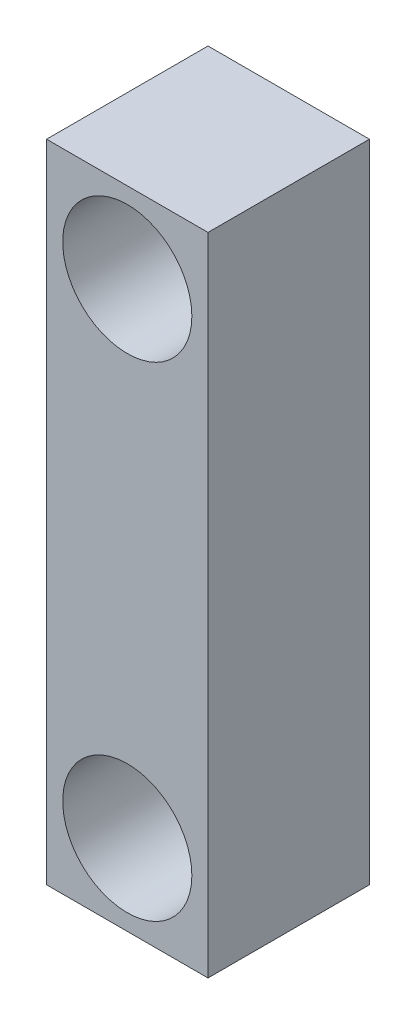
ISO-10303-21;
HEADER;
FILE_DESCRIPTION(('STEP AP214'),'2;1');
FILE_NAME('part.step','',(''),(''),'','','');
FILE_SCHEMA(('AUTOMOTIVE_DESIGN { 1 0 10303 214 1 1 1 1 }'));
ENDSEC;
DATA;
#1=APPLICATION_CONTEXT('core data for automotive mechanical design processes');
#2=APPLICATION_PROTOCOL_DEFINITION('international standard','automotive_design',2000,#1);
#3=PRODUCT_CONTEXT('',#1,'mechanical');
#4=PRODUCT('Part','Part','',(#3));
#5=PRODUCT_RELATED_PRODUCT_CATEGORY('part','',(#4));
#6=PRODUCT_DEFINITION_FORMATION('','',#4);
#7=PRODUCT_DEFINITION_CONTEXT('part definition',#1,'design');
#8=PRODUCT_DEFINITION('design','',#6,#7);
#9=PRODUCT_DEFINITION_SHAPE('','',#8);
#10=(LENGTH_UNIT() NAMED_UNIT(*) SI_UNIT(.MILLI.,.METRE.));
#11=(NAMED_UNIT(*) PLANE_ANGLE_UNIT() SI_UNIT($,.RADIAN.));
#12=(NAMED_UNIT(*) SI_UNIT($,.STERADIAN.) SOLID_ANGLE_UNIT());
#13=UNCERTAINTY_MEASURE_WITH_UNIT(LENGTH_MEASURE(1.E-05),#10,'distance_accuracy_value','');
#14=(GEOMETRIC_REPRESENTATION_CONTEXT(3) GLOBAL_UNCERTAINTY_ASSIGNED_CONTEXT((#13)) GLOBAL_UNIT_ASSIGNED_CONTEXT((#10,
#11,#12)) REPRESENTATION_CONTEXT('',''));
#15=CARTESIAN_POINT('',(0.,0.,0.));
#16=DIRECTION('',(0.,0.,1.));
#17=DIRECTION('',(1.,0.,0.));
#18=AXIS2_PLACEMENT_3D('',#15,#16,#17);
#19=CARTESIAN_POINT('',(38.1,152.4,50.8));
#20=DIRECTION('',(-1.,0.,0.));
#21=DIRECTION('',(0.,-1.,0.));
#22=AXIS2_PLACEMENT_3D('',#19,#20,#21);
#23=PLANE('',#22);
#24=DIRECTION('',(0.,1.,0.));
#25=VECTOR('',#24,1.);
#26=CARTESIAN_POINT('',(38.1,152.4,-25.4));
#27=LINE('',#26,#25);
#28=CARTESIAN_POINT('',(38.1,-152.4,-25.4));
#29=VERTEX_POINT('',#28);
#30=CARTESIAN_POINT('',(38.1,152.4,-25.4));
#31=VERTEX_POINT('',#30);
#32=EDGE_CURVE('E97',#29,#31,#27,.T.);
#33=ORIENTED_EDGE('',*,*,#32,.T.);
#34=DIRECTION('',(0.,0.,-1.));
#35=VECTOR('',#34,1.);
#36=CARTESIAN_POINT('',(38.1,152.4,50.8));
#37=LINE('',#36,#35);
#38=CARTESIAN_POINT('',(38.1,152.4,50.8));
#39=VERTEX_POINT('',#38);
#40=EDGE_CURVE('E11',#39,#31,#37,.T.);
#41=ORIENTED_EDGE('',*,*,#40,.F.);
#42=DIRECTION('',(0.,1.,0.));
#43=VECTOR('',#42,1.);
#44=CARTESIAN_POINT('',(38.1,152.4,50.8));
#45=LINE('',#44,#43);
#46=CARTESIAN_POINT('',(38.1,-152.4,50.8));
#47=VERTEX_POINT('',#46);
#48=EDGE_CURVE('E85',#47,#39,#45,.T.);
#49=ORIENTED_EDGE('',*,*,#48,.F.);
#50=DIRECTION('',(0.,0.,-1.));
#51=VECTOR('',#50,1.);
#52=CARTESIAN_POINT('',(38.1,-152.4,50.8));
#53=LINE('',#52,#51);
#54=EDGE_CURVE('E93',#47,#29,#53,.T.);
#55=ORIENTED_EDGE('',*,*,#54,.T.);
#56=EDGE_LOOP('',(#33,#41,#49,#55));
#57=FACE_BOUND('',#56,.T.);
#58=ADVANCED_FACE('F34',(#57),#23,.F.);
#59=CARTESIAN_POINT('',(-38.1,152.4,50.8));
#60=DIRECTION('',(0.,-1.,0.));
#61=DIRECTION('',(0.,0.,-1.));
#62=AXIS2_PLACEMENT_3D('',#59,#60,#61);
#63=PLANE('',#62);
#64=DIRECTION('',(-1.,0.,0.));
#65=VECTOR('',#64,1.);
#66=CARTESIAN_POINT('',(-38.1,152.4,-25.4));
#67=LINE('',#66,#65);
#68=CARTESIAN_POINT('',(-38.1,152.4,-25.4));
#69=VERTEX_POINT('',#68);
#70=EDGE_CURVE('E89',#31,#69,#67,.T.);
#71=ORIENTED_EDGE('',*,*,#70,.T.);
#72=DIRECTION('',(0.,0.,-1.));
#73=VECTOR('',#72,1.);
#74=CARTESIAN_POINT('',(-38.1,152.4,50.8));
#75=LINE('',#74,#73);
#76=CARTESIAN_POINT('',(-38.1,152.4,50.8));
#77=VERTEX_POINT('',#76);
#78=EDGE_CURVE('E42',#77,#69,#75,.T.);
#79=ORIENTED_EDGE('',*,*,#78,.F.);
#80=DIRECTION('',(-1.,0.,0.));
#81=VECTOR('',#80,1.);
#82=CARTESIAN_POINT('',(-38.1,152.4,50.8));
#83=LINE('',#82,#81);
#84=EDGE_CURVE('E80',#39,#77,#83,.T.);
#85=ORIENTED_EDGE('',*,*,#84,.F.);
#86=ORIENTED_EDGE('',*,*,#40,.T.);
#87=EDGE_LOOP('',(#71,#79,#85,#86));
#88=FACE_BOUND('',#87,.T.);
#89=ADVANCED_FACE('F88',(#88),#63,.F.);
#90=CARTESIAN_POINT('',(-38.1,152.4,50.8));
#91=DIRECTION('',(1.,0.,0.));
#92=DIRECTION('',(0.,1.,0.));
#93=AXIS2_PLACEMENT_3D('',#90,#91,#92);
#94=PLANE('',#93);
#95=DIRECTION('',(0.,-1.,0.));
#96=VECTOR('',#95,1.);
#97=CARTESIAN_POINT('',(-38.1,152.4,-25.4));
#98=LINE('',#97,#96);
#99=CARTESIAN_POINT('',(-38.1,-152.4,-25.4));
#100=VERTEX_POINT('',#99);
#101=EDGE_CURVE('E67',#69,#100,#98,.T.);
#102=ORIENTED_EDGE('',*,*,#101,.T.);
#103=DIRECTION('',(0.,0.,-1.));
#104=VECTOR('',#103,1.);
#105=CARTESIAN_POINT('',(-38.1,-152.4,50.8));
#106=LINE('',#105,#104);
#107=CARTESIAN_POINT('',(-38.1,-152.4,50.8));
#108=VERTEX_POINT('',#107);
#109=EDGE_CURVE('E90',#108,#100,#106,.T.);
#110=ORIENTED_EDGE('',*,*,#109,.F.);
#111=DIRECTION('',(0.,-1.,0.));
#112=VECTOR('',#111,1.);
#113=CARTESIAN_POINT('',(-38.1,152.4,50.8));
#114=LINE('',#113,#112);
#115=EDGE_CURVE('E83',#77,#108,#114,.T.);
#116=ORIENTED_EDGE('',*,*,#115,.F.);
#117=ORIENTED_EDGE('',*,*,#78,.T.);
#118=EDGE_LOOP('',(#102,#110,#116,#117));
#119=FACE_BOUND('',#118,.T.);
#120=ADVANCED_FACE('F91',(#119),#94,.F.);
#121=CARTESIAN_POINT('',(-38.1,-152.4,50.8));
#122=DIRECTION('',(0.,1.,0.));
#123=DIRECTION('',(0.,0.,1.));
#124=AXIS2_PLACEMENT_3D('',#121,#122,#123);
#125=PLANE('',#124);
#126=DIRECTION('',(1.,0.,0.));
#127=VECTOR('',#126,1.);
#128=CARTESIAN_POINT('',(-38.1,-152.4,-25.4));
#129=LINE('',#128,#127);
#130=EDGE_CURVE('E73',#100,#29,#129,.T.);
#131=ORIENTED_EDGE('',*,*,#130,.T.);
#132=ORIENTED_EDGE('',*,*,#54,.F.);
#133=DIRECTION('',(1.,0.,0.));
#134=VECTOR('',#133,1.);
#135=CARTESIAN_POINT('',(-38.1,-152.4,50.8));
#136=LINE('',#135,#134);
#137=EDGE_CURVE('E50',#108,#47,#136,.T.);
#138=ORIENTED_EDGE('',*,*,#137,.F.);
#139=ORIENTED_EDGE('',*,*,#109,.T.);
#140=EDGE_LOOP('',(#131,#132,#138,#139));
#141=FACE_BOUND('',#140,.T.);
#142=ADVANCED_FACE('F105',(#141),#125,.F.);
#143=CARTESIAN_POINT('',(0.,0.,50.8));
#144=DIRECTION('',(0.,0.,1.));
#145=DIRECTION('',(1.,0.,0.));
#146=AXIS2_PLACEMENT_3D('',#143,#144,#145);
#147=PLANE('',#146);
#148=CARTESIAN_POINT('',(0.,-114.3,50.8));
#149=DIRECTION('',(0.,0.,1.));
#150=DIRECTION('',(1.,0.,0.));
#151=AXIS2_PLACEMENT_3D('',#148,#149,#150);
#152=CIRCLE('',#151,30.48);
#153=CARTESIAN_POINT('',(30.48,-114.3,50.8));
#154=VERTEX_POINT('',#153);
#155=EDGE_CURVE('E117',#154,#154,#152,.T.);
#156=ORIENTED_EDGE('',*,*,#155,.F.);
#157=EDGE_LOOP('',(#156));
#158=FACE_BOUND('',#157,.T.);
#159=CARTESIAN_POINT('',(0.,114.3,50.8));
#160=DIRECTION('',(0.,0.,1.));
#161=DIRECTION('',(1.,0.,0.));
#162=AXIS2_PLACEMENT_3D('',#159,#160,#161);
#163=CIRCLE('',#162,30.48);
#164=CARTESIAN_POINT('',(30.48,114.3,50.8));
#165=VERTEX_POINT('',#164);
#166=EDGE_CURVE('E111',#165,#165,#163,.T.);
#167=ORIENTED_EDGE('',*,*,#166,.F.);
#168=EDGE_LOOP('',(#167));
#169=FACE_BOUND('',#168,.T.);
#170=ORIENTED_EDGE('',*,*,#48,.T.);
#171=ORIENTED_EDGE('',*,*,#84,.T.);
#172=ORIENTED_EDGE('',*,*,#115,.T.);
#173=ORIENTED_EDGE('',*,*,#137,.T.);
#174=EDGE_LOOP('',(#170,#171,#172,#173));
#175=FACE_BOUND('',#174,.T.);
#176=ADVANCED_FACE('F81',(#158,#169,#175),#147,.T.);
#177=CARTESIAN_POINT('',(0.,0.,-25.4));
#178=DIRECTION('',(0.,0.,1.));
#179=DIRECTION('',(1.,0.,0.));
#180=AXIS2_PLACEMENT_3D('',#177,#178,#179);
#181=PLANE('',#180);
#182=CARTESIAN_POINT('',(0.,-114.3,-25.4));
#183=DIRECTION('',(0.,0.,1.));
#184=DIRECTION('',(1.,0.,0.));
#185=AXIS2_PLACEMENT_3D('',#182,#183,#184);
#186=CIRCLE('',#185,30.48);
#187=CARTESIAN_POINT('',(30.48,-114.3,-25.4));
#188=VERTEX_POINT('',#187);
#189=EDGE_CURVE('E100',#188,#188,#186,.T.);
#190=ORIENTED_EDGE('',*,*,#189,.T.);
#191=EDGE_LOOP('',(#190));
#192=FACE_BOUND('',#191,.T.);
#193=CARTESIAN_POINT('',(0.,114.3,-25.4));
#194=DIRECTION('',(0.,0.,1.));
#195=DIRECTION('',(1.,0.,0.));
#196=AXIS2_PLACEMENT_3D('',#193,#194,#195);
#197=CIRCLE('',#196,30.48);
#198=CARTESIAN_POINT('',(30.48,114.3,-25.4));
#199=VERTEX_POINT('',#198);
#200=EDGE_CURVE('E114',#199,#199,#197,.T.);
#201=ORIENTED_EDGE('',*,*,#200,.T.);
#202=EDGE_LOOP('',(#201));
#203=FACE_BOUND('',#202,.T.);
#204=ORIENTED_EDGE('',*,*,#32,.F.);
#205=ORIENTED_EDGE('',*,*,#130,.F.);
#206=ORIENTED_EDGE('',*,*,#101,.F.);
#207=ORIENTED_EDGE('',*,*,#70,.F.);
#208=EDGE_LOOP('',(#204,#205,#206,#207));
#209=FACE_BOUND('',#208,.T.);
#210=ADVANCED_FACE('F108',(#192,#203,#209),#181,.F.);
#211=CARTESIAN_POINT('',(0.,114.3,-25.4));
#212=DIRECTION('',(0.,0.,1.));
#213=DIRECTION('',(1.,0.,0.));
#214=AXIS2_PLACEMENT_3D('',#211,#212,#213);
#215=CYLINDRICAL_SURFACE('',#214,30.48);
#216=ORIENTED_EDGE('',*,*,#200,.F.);
#217=EDGE_LOOP('',(#216));
#218=FACE_BOUND('',#217,.T.);
#219=ORIENTED_EDGE('',*,*,#166,.T.);
#220=EDGE_LOOP('',(#219));
#221=FACE_BOUND('',#220,.T.);
#222=ADVANCED_FACE('F128',(#218,#221),#215,.F.);
#223=CARTESIAN_POINT('',(0.,-114.3,-25.4));
#224=DIRECTION('',(0.,0.,1.));
#225=DIRECTION('',(1.,0.,0.));
#226=AXIS2_PLACEMENT_3D('',#223,#224,#225);
#227=CYLINDRICAL_SURFACE('',#226,30.48);
#228=ORIENTED_EDGE('',*,*,#189,.F.);
#229=EDGE_LOOP('',(#228));
#230=FACE_BOUND('',#229,.T.);
#231=ORIENTED_EDGE('',*,*,#155,.T.);
#232=EDGE_LOOP('',(#231));
#233=FACE_BOUND('',#232,.T.);
#234=ADVANCED_FACE('F125',(#230,#233),#227,.F.);
#235=CLOSED_SHELL('',(#58,#89,#120,#142,#176,#210,#222,#234));
#236=MANIFOLD_SOLID_BREP('B2',#235);
#237=ADVANCED_BREP_SHAPE_REPRESENTATION('',(#18,#236),#14);
#238=SHAPE_DEFINITION_REPRESENTATION(#9,#237);
ENDSEC;
END-ISO-10303-21;
